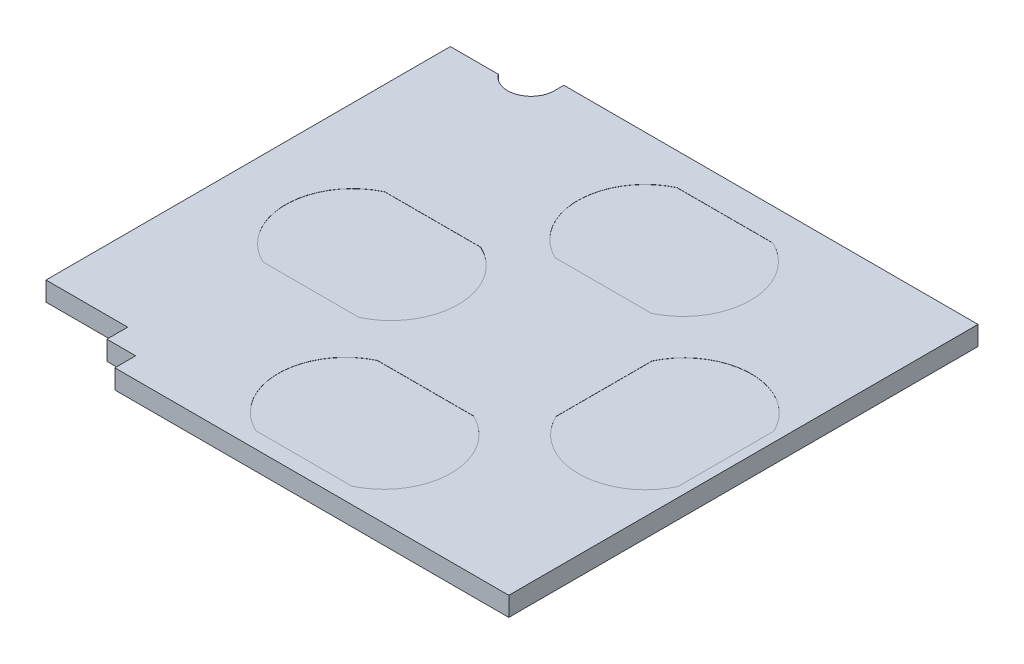
ISO-10303-21;
HEADER;
FILE_DESCRIPTION(('STEP AP214'),'2;1');
FILE_NAME('part.step','',(''),(''),'','','');
FILE_SCHEMA(('AUTOMOTIVE_DESIGN { 1 0 10303 214 1 1 1 1 }'));
ENDSEC;
DATA;
#1=APPLICATION_CONTEXT('core data for automotive mechanical design processes');
#2=APPLICATION_PROTOCOL_DEFINITION('international standard','automotive_design',2000,#1);
#3=PRODUCT_CONTEXT('',#1,'mechanical');
#4=PRODUCT('Part','Part','',(#3));
#5=PRODUCT_RELATED_PRODUCT_CATEGORY('part','',(#4));
#6=PRODUCT_DEFINITION_FORMATION('','',#4);
#7=PRODUCT_DEFINITION_CONTEXT('part definition',#1,'design');
#8=PRODUCT_DEFINITION('design','',#6,#7);
#9=PRODUCT_DEFINITION_SHAPE('','',#8);
#10=(LENGTH_UNIT() NAMED_UNIT(*) SI_UNIT(.MILLI.,.METRE.));
#11=(NAMED_UNIT(*) PLANE_ANGLE_UNIT() SI_UNIT($,.RADIAN.));
#12=(NAMED_UNIT(*) SI_UNIT($,.STERADIAN.) SOLID_ANGLE_UNIT());
#13=UNCERTAINTY_MEASURE_WITH_UNIT(LENGTH_MEASURE(1.E-05),#10,'distance_accuracy_value','');
#14=(GEOMETRIC_REPRESENTATION_CONTEXT(3) GLOBAL_UNCERTAINTY_ASSIGNED_CONTEXT((#13)) GLOBAL_UNIT_ASSIGNED_CONTEXT((#10,
#11,#12)) REPRESENTATION_CONTEXT('',''));
#15=CARTESIAN_POINT('',(0.,0.,0.));
#16=DIRECTION('',(0.,0.,1.));
#17=DIRECTION('',(1.,0.,0.));
#18=AXIS2_PLACEMENT_3D('',#15,#16,#17);
#19=CARTESIAN_POINT('',(-11.5711231832594,1.2,-12.7581254575403));
#20=DIRECTION('',(0.,-1.,0.));
#21=DIRECTION('',(0.,0.,-1.));
#22=AXIS2_PLACEMENT_3D('',#19,#20,#21);
#23=CYLINDRICAL_SURFACE('',#22,1.45812545754029);
#24=DIRECTION('',(0.,1.,0.));
#25=VECTOR('',#24,1.);
#26=CARTESIAN_POINT('',(-10.1129977257192,0.,-12.7581254575403));
#27=LINE('',#26,#25);
#28=CARTESIAN_POINT('',(-10.1129977257192,0.,-12.7581254575403));
#29=VERTEX_POINT('',#28);
#30=CARTESIAN_POINT('',(-10.1129977257192,1.2,-12.7581254575403));
#31=VERTEX_POINT('',#30);
#32=EDGE_CURVE('E350',#29,#31,#27,.T.);
#33=ORIENTED_EDGE('',*,*,#32,.F.);
#34=CARTESIAN_POINT('',(-11.5711231832594,0.,-12.7581254575403));
#35=DIRECTION('',(0.,-1.,0.));
#36=DIRECTION('',(0.,0.,1.));
#37=AXIS2_PLACEMENT_3D('',#34,#35,#36);
#38=CIRCLE('',#37,1.45812545754029);
#39=CARTESIAN_POINT('',(-12.75,0.,-11.9));
#40=VERTEX_POINT('',#39);
#41=EDGE_CURVE('E355',#29,#40,#38,.T.);
#42=ORIENTED_EDGE('',*,*,#41,.T.);
#43=DIRECTION('',(0.,-1.,0.));
#44=VECTOR('',#43,1.);
#45=CARTESIAN_POINT('',(-12.75,1.2,-11.9));
#46=LINE('',#45,#44);
#47=CARTESIAN_POINT('',(-12.75,1.2,-11.9));
#48=VERTEX_POINT('',#47);
#49=EDGE_CURVE('E11',#48,#40,#46,.T.);
#50=ORIENTED_EDGE('',*,*,#49,.F.);
#51=CARTESIAN_POINT('',(-11.5711231832594,1.2,-12.7581254575403));
#52=DIRECTION('',(0.,-1.,0.));
#53=DIRECTION('',(0.,0.,1.));
#54=AXIS2_PLACEMENT_3D('',#51,#52,#53);
#55=CIRCLE('',#54,1.45812545754029);
#56=EDGE_CURVE('E357',#31,#48,#55,.T.);
#57=ORIENTED_EDGE('',*,*,#56,.F.);
#58=EDGE_LOOP('',(#33,#42,#50,#57));
#59=FACE_BOUND('',#58,.T.);
#60=ADVANCED_FACE('F36',(#59),#23,.F.);
#61=CARTESIAN_POINT('',(-15.75,1.2,-11.9));
#62=DIRECTION('',(0.,0.,1.));
#63=DIRECTION('',(1.,0.,0.));
#64=AXIS2_PLACEMENT_3D('',#61,#62,#63);
#65=PLANE('',#64);
#66=DIRECTION('',(-1.,0.,0.));
#67=VECTOR('',#66,1.);
#68=CARTESIAN_POINT('',(-15.75,0.,-11.9));
#69=LINE('',#68,#67);
#70=CARTESIAN_POINT('',(-15.75,0.,-11.9));
#71=VERTEX_POINT('',#70);
#72=EDGE_CURVE('E381',#40,#71,#69,.T.);
#73=ORIENTED_EDGE('',*,*,#72,.T.);
#74=DIRECTION('',(0.,-1.,0.));
#75=VECTOR('',#74,1.);
#76=CARTESIAN_POINT('',(-15.75,1.2,-11.9));
#77=LINE('',#76,#75);
#78=CARTESIAN_POINT('',(-15.75,1.2,-11.9));
#79=VERTEX_POINT('',#78);
#80=EDGE_CURVE('E43',#79,#71,#77,.T.);
#81=ORIENTED_EDGE('',*,*,#80,.F.);
#82=DIRECTION('',(-1.,0.,0.));
#83=VECTOR('',#82,1.);
#84=CARTESIAN_POINT('',(-15.75,1.2,-11.9));
#85=LINE('',#84,#83);
#86=EDGE_CURVE('E359',#48,#79,#85,.T.);
#87=ORIENTED_EDGE('',*,*,#86,.F.);
#88=ORIENTED_EDGE('',*,*,#49,.T.);
#89=EDGE_LOOP('',(#73,#81,#87,#88));
#90=FACE_BOUND('',#89,.T.);
#91=ADVANCED_FACE('F449',(#90),#65,.F.);
#92=CARTESIAN_POINT('',(-15.75,1.2,13.35));
#93=DIRECTION('',(1.,0.,0.));
#94=DIRECTION('',(0.,0.,-1.));
#95=AXIS2_PLACEMENT_3D('',#92,#93,#94);
#96=PLANE('',#95);
#97=DIRECTION('',(0.,0.,1.));
#98=VECTOR('',#97,1.);
#99=CARTESIAN_POINT('',(-15.75,0.,13.35));
#100=LINE('',#99,#98);
#101=CARTESIAN_POINT('',(-15.75,0.,13.35));
#102=VERTEX_POINT('',#101);
#103=EDGE_CURVE('E383',#71,#102,#100,.T.);
#104=ORIENTED_EDGE('',*,*,#103,.T.);
#105=DIRECTION('',(0.,-1.,0.));
#106=VECTOR('',#105,1.);
#107=CARTESIAN_POINT('',(-15.75,1.2,13.35));
#108=LINE('',#107,#106);
#109=CARTESIAN_POINT('',(-15.75,1.2,13.35));
#110=VERTEX_POINT('',#109);
#111=EDGE_CURVE('E416',#110,#102,#108,.T.);
#112=ORIENTED_EDGE('',*,*,#111,.F.);
#113=DIRECTION('',(0.,0.,1.));
#114=VECTOR('',#113,1.);
#115=CARTESIAN_POINT('',(-15.75,1.2,13.35));
#116=LINE('',#115,#114);
#117=EDGE_CURVE('E362',#79,#110,#116,.T.);
#118=ORIENTED_EDGE('',*,*,#117,.F.);
#119=ORIENTED_EDGE('',*,*,#80,.T.);
#120=EDGE_LOOP('',(#104,#112,#118,#119));
#121=FACE_BOUND('',#120,.T.);
#122=ADVANCED_FACE('F423',(#121),#96,.F.);
#123=CARTESIAN_POINT('',(-10.65,1.2,13.35));
#124=DIRECTION('',(0.,0.,-1.));
#125=DIRECTION('',(-1.,0.,0.));
#126=AXIS2_PLACEMENT_3D('',#123,#124,#125);
#127=PLANE('',#126);
#128=DIRECTION('',(1.,0.,0.));
#129=VECTOR('',#128,1.);
#130=CARTESIAN_POINT('',(-10.65,0.,13.35));
#131=LINE('',#130,#129);
#132=CARTESIAN_POINT('',(-10.65,0.,13.35));
#133=VERTEX_POINT('',#132);
#134=EDGE_CURVE('E385',#102,#133,#131,.T.);
#135=ORIENTED_EDGE('',*,*,#134,.T.);
#136=DIRECTION('',(0.,-1.,0.));
#137=VECTOR('',#136,1.);
#138=CARTESIAN_POINT('',(-10.65,1.2,13.35));
#139=LINE('',#138,#137);
#140=CARTESIAN_POINT('',(-10.65,1.2,13.35));
#141=VERTEX_POINT('',#140);
#142=EDGE_CURVE('E413',#141,#133,#139,.T.);
#143=ORIENTED_EDGE('',*,*,#142,.F.);
#144=DIRECTION('',(1.,0.,0.));
#145=VECTOR('',#144,1.);
#146=CARTESIAN_POINT('',(-10.65,1.2,13.35));
#147=LINE('',#146,#145);
#148=EDGE_CURVE('E364',#110,#141,#147,.T.);
#149=ORIENTED_EDGE('',*,*,#148,.F.);
#150=ORIENTED_EDGE('',*,*,#111,.T.);
#151=EDGE_LOOP('',(#135,#143,#149,#150));
#152=FACE_BOUND('',#151,.T.);
#153=ADVANCED_FACE('F436',(#152),#127,.F.);
#154=CARTESIAN_POINT('',(-10.65,1.2,14.65));
#155=DIRECTION('',(1.,0.,0.));
#156=DIRECTION('',(0.,0.,-1.));
#157=AXIS2_PLACEMENT_3D('',#154,#155,#156);
#158=PLANE('',#157);
#159=DIRECTION('',(0.,0.,1.));
#160=VECTOR('',#159,1.);
#161=CARTESIAN_POINT('',(-10.65,0.,14.65));
#162=LINE('',#161,#160);
#163=CARTESIAN_POINT('',(-10.65,0.,14.65));
#164=VERTEX_POINT('',#163);
#165=EDGE_CURVE('E387',#133,#164,#162,.T.);
#166=ORIENTED_EDGE('',*,*,#165,.T.);
#167=DIRECTION('',(0.,-1.,0.));
#168=VECTOR('',#167,1.);
#169=CARTESIAN_POINT('',(-10.65,1.2,14.65));
#170=LINE('',#169,#168);
#171=CARTESIAN_POINT('',(-10.65,1.2,14.65));
#172=VERTEX_POINT('',#171);
#173=EDGE_CURVE('E410',#172,#164,#170,.T.);
#174=ORIENTED_EDGE('',*,*,#173,.F.);
#175=DIRECTION('',(0.,0.,1.));
#176=VECTOR('',#175,1.);
#177=CARTESIAN_POINT('',(-10.65,1.2,14.65));
#178=LINE('',#177,#176);
#179=EDGE_CURVE('E366',#141,#172,#178,.T.);
#180=ORIENTED_EDGE('',*,*,#179,.F.);
#181=ORIENTED_EDGE('',*,*,#142,.T.);
#182=EDGE_LOOP('',(#166,#174,#180,#181));
#183=FACE_BOUND('',#182,.T.);
#184=ADVANCED_FACE('F440',(#183),#158,.F.);
#185=CARTESIAN_POINT('',(-8.85000000000001,1.2,14.65));
#186=DIRECTION('',(0.,0.,-1.));
#187=DIRECTION('',(-1.,0.,0.));
#188=AXIS2_PLACEMENT_3D('',#185,#186,#187);
#189=PLANE('',#188);
#190=DIRECTION('',(1.,0.,0.));
#191=VECTOR('',#190,1.);
#192=CARTESIAN_POINT('',(-8.85000000000001,0.,14.65));
#193=LINE('',#192,#191);
#194=CARTESIAN_POINT('',(-8.85000000000001,0.,14.65));
#195=VERTEX_POINT('',#194);
#196=EDGE_CURVE('E389',#164,#195,#193,.T.);
#197=ORIENTED_EDGE('',*,*,#196,.T.);
#198=DIRECTION('',(0.,-1.,0.));
#199=VECTOR('',#198,1.);
#200=CARTESIAN_POINT('',(-8.85000000000001,1.2,14.65));
#201=LINE('',#200,#199);
#202=CARTESIAN_POINT('',(-8.85000000000001,1.2,14.65));
#203=VERTEX_POINT('',#202);
#204=EDGE_CURVE('E407',#203,#195,#201,.T.);
#205=ORIENTED_EDGE('',*,*,#204,.F.);
#206=DIRECTION('',(1.,0.,0.));
#207=VECTOR('',#206,1.);
#208=CARTESIAN_POINT('',(-8.85000000000001,1.2,14.65));
#209=LINE('',#208,#207);
#210=EDGE_CURVE('E368',#172,#203,#209,.T.);
#211=ORIENTED_EDGE('',*,*,#210,.F.);
#212=ORIENTED_EDGE('',*,*,#173,.T.);
#213=EDGE_LOOP('',(#197,#205,#211,#212));
#214=FACE_BOUND('',#213,.T.);
#215=ADVANCED_FACE('F473',(#214),#189,.F.);
#216=CARTESIAN_POINT('',(-8.85,1.2,15.95));
#217=DIRECTION('',(1.,0.,0.));
#218=DIRECTION('',(0.,0.,-1.));
#219=AXIS2_PLACEMENT_3D('',#216,#217,#218);
#220=PLANE('',#219);
#221=DIRECTION('',(0.,0.,1.));
#222=VECTOR('',#221,1.);
#223=CARTESIAN_POINT('',(-8.85,0.,15.95));
#224=LINE('',#223,#222);
#225=CARTESIAN_POINT('',(-8.85,0.,15.95));
#226=VERTEX_POINT('',#225);
#227=EDGE_CURVE('E391',#195,#226,#224,.T.);
#228=ORIENTED_EDGE('',*,*,#227,.T.);
#229=DIRECTION('',(0.,-1.,0.));
#230=VECTOR('',#229,1.);
#231=CARTESIAN_POINT('',(-8.85,1.2,15.95));
#232=LINE('',#231,#230);
#233=CARTESIAN_POINT('',(-8.85,1.2,15.95));
#234=VERTEX_POINT('',#233);
#235=EDGE_CURVE('E404',#234,#226,#232,.T.);
#236=ORIENTED_EDGE('',*,*,#235,.F.);
#237=DIRECTION('',(0.,0.,1.));
#238=VECTOR('',#237,1.);
#239=CARTESIAN_POINT('',(-8.85,1.2,15.95));
#240=LINE('',#239,#238);
#241=EDGE_CURVE('E370',#203,#234,#240,.T.);
#242=ORIENTED_EDGE('',*,*,#241,.F.);
#243=ORIENTED_EDGE('',*,*,#204,.T.);
#244=EDGE_LOOP('',(#228,#236,#242,#243));
#245=FACE_BOUND('',#244,.T.);
#246=ADVANCED_FACE('F471',(#245),#220,.F.);
#247=CARTESIAN_POINT('',(15.75,1.2,15.95));
#248=DIRECTION('',(0.,0.,-1.));
#249=DIRECTION('',(-1.,0.,0.));
#250=AXIS2_PLACEMENT_3D('',#247,#248,#249);
#251=PLANE('',#250);
#252=DIRECTION('',(1.,0.,0.));
#253=VECTOR('',#252,1.);
#254=CARTESIAN_POINT('',(15.75,0.,15.95));
#255=LINE('',#254,#253);
#256=CARTESIAN_POINT('',(15.75,0.,15.95));
#257=VERTEX_POINT('',#256);
#258=EDGE_CURVE('E393',#226,#257,#255,.T.);
#259=ORIENTED_EDGE('',*,*,#258,.T.);
#260=DIRECTION('',(0.,-1.,0.));
#261=VECTOR('',#260,1.);
#262=CARTESIAN_POINT('',(15.75,1.2,15.95));
#263=LINE('',#262,#261);
#264=CARTESIAN_POINT('',(15.75,1.2,15.95));
#265=VERTEX_POINT('',#264);
#266=EDGE_CURVE('E401',#265,#257,#263,.T.);
#267=ORIENTED_EDGE('',*,*,#266,.F.);
#268=DIRECTION('',(1.,0.,0.));
#269=VECTOR('',#268,1.);
#270=CARTESIAN_POINT('',(15.75,1.2,15.95));
#271=LINE('',#270,#269);
#272=EDGE_CURVE('E372',#234,#265,#271,.T.);
#273=ORIENTED_EDGE('',*,*,#272,.F.);
#274=ORIENTED_EDGE('',*,*,#235,.T.);
#275=EDGE_LOOP('',(#259,#267,#273,#274));
#276=FACE_BOUND('',#275,.T.);
#277=ADVANCED_FACE('F466',(#276),#251,.F.);
#278=CARTESIAN_POINT('',(15.75,1.2,-13.35));
#279=DIRECTION('',(-1.,0.,0.));
#280=DIRECTION('',(0.,0.,1.));
#281=AXIS2_PLACEMENT_3D('',#278,#279,#280);
#282=PLANE('',#281);
#283=DIRECTION('',(0.,0.,-1.));
#284=VECTOR('',#283,1.);
#285=CARTESIAN_POINT('',(15.75,0.,-13.35));
#286=LINE('',#285,#284);
#287=CARTESIAN_POINT('',(15.75,0.,-13.35));
#288=VERTEX_POINT('',#287);
#289=EDGE_CURVE('E395',#257,#288,#286,.T.);
#290=ORIENTED_EDGE('',*,*,#289,.T.);
#291=DIRECTION('',(0.,-1.,0.));
#292=VECTOR('',#291,1.);
#293=CARTESIAN_POINT('',(15.75,1.2,-13.35));
#294=LINE('',#293,#292);
#295=CARTESIAN_POINT('',(15.75,1.2,-13.35));
#296=VERTEX_POINT('',#295);
#297=EDGE_CURVE('E379',#296,#288,#294,.T.);
#298=ORIENTED_EDGE('',*,*,#297,.F.);
#299=DIRECTION('',(0.,0.,-1.));
#300=VECTOR('',#299,1.);
#301=CARTESIAN_POINT('',(15.75,1.2,-13.35));
#302=LINE('',#301,#300);
#303=EDGE_CURVE('E374',#265,#296,#302,.T.);
#304=ORIENTED_EDGE('',*,*,#303,.F.);
#305=ORIENTED_EDGE('',*,*,#266,.T.);
#306=EDGE_LOOP('',(#290,#298,#304,#305));
#307=FACE_BOUND('',#306,.T.);
#308=ADVANCED_FACE('F461',(#307),#282,.F.);
#309=CARTESIAN_POINT('',(-10.2385263290251,1.2,-13.35));
#310=DIRECTION('',(0.,0.,1.));
#311=DIRECTION('',(1.,0.,0.));
#312=AXIS2_PLACEMENT_3D('',#309,#310,#311);
#313=PLANE('',#312);
#314=DIRECTION('',(-1.,0.,0.));
#315=VECTOR('',#314,1.);
#316=CARTESIAN_POINT('',(-10.2385263290251,0.,-13.35));
#317=LINE('',#316,#315);
#318=CARTESIAN_POINT('',(-10.1129977257192,0.,-13.35));
#319=VERTEX_POINT('',#318);
#320=EDGE_CURVE('E360',#288,#319,#317,.T.);
#321=ORIENTED_EDGE('',*,*,#320,.T.);
#322=DIRECTION('',(0.,1.,0.));
#323=VECTOR('',#322,1.);
#324=CARTESIAN_POINT('',(-10.1129977257192,0.,-13.35));
#325=LINE('',#324,#323);
#326=CARTESIAN_POINT('',(-10.1129977257192,1.2,-13.35));
#327=VERTEX_POINT('',#326);
#328=EDGE_CURVE('E352',#319,#327,#325,.T.);
#329=ORIENTED_EDGE('',*,*,#328,.T.);
#330=DIRECTION('',(-1.,0.,0.));
#331=VECTOR('',#330,1.);
#332=CARTESIAN_POINT('',(-10.2385263290251,1.2,-13.35));
#333=LINE('',#332,#331);
#334=EDGE_CURVE('E376',#296,#327,#333,.T.);
#335=ORIENTED_EDGE('',*,*,#334,.F.);
#336=ORIENTED_EDGE('',*,*,#297,.T.);
#337=EDGE_LOOP('',(#321,#329,#335,#336));
#338=FACE_BOUND('',#337,.T.);
#339=ADVANCED_FACE('F456',(#338),#313,.F.);
#340=CARTESIAN_POINT('',(-11.5711231832594,1.2,-12.7581254575403));
#341=DIRECTION('',(0.,1.,0.));
#342=DIRECTION('',(0.,0.,1.));
#343=AXIS2_PLACEMENT_3D('',#340,#341,#342);
#344=PLANE('',#343);
#345=CARTESIAN_POINT('',(0.758333333333339,1.2,-7.55));
#346=DIRECTION('',(0.,1.,0.));
#347=DIRECTION('',(0.,0.,-1.));
#348=AXIS2_PLACEMENT_3D('',#345,#346,#347);
#349=CIRCLE('',#348,4.20833333333333);
#350=CARTESIAN_POINT('',(-1.05,1.2,-11.35));
#351=VERTEX_POINT('',#350);
#352=CARTESIAN_POINT('',(-1.05,1.2,-3.75));
#353=VERTEX_POINT('',#352);
#354=EDGE_CURVE('E50',#351,#353,#349,.T.);
#355=ORIENTED_EDGE('',*,*,#354,.F.);
#356=DIRECTION('',(-1.,0.,0.));
#357=VECTOR('',#356,1.);
#358=CARTESIAN_POINT('',(-1.05,1.2,-11.35));
#359=LINE('',#358,#357);
#360=CARTESIAN_POINT('',(4.95,1.2,-11.35));
#361=VERTEX_POINT('',#360);
#362=EDGE_CURVE('E234',#361,#351,#359,.T.);
#363=ORIENTED_EDGE('',*,*,#362,.F.);
#364=CARTESIAN_POINT('',(3.14166666666667,1.2,-7.55));
#365=DIRECTION('',(0.,1.,0.));
#366=DIRECTION('',(0.,0.,-1.));
#367=AXIS2_PLACEMENT_3D('',#364,#365,#366);
#368=CIRCLE('',#367,4.20833333333333);
#369=CARTESIAN_POINT('',(4.95,1.2,-3.75));
#370=VERTEX_POINT('',#369);
#371=EDGE_CURVE('E237',#370,#361,#368,.T.);
#372=ORIENTED_EDGE('',*,*,#371,.F.);
#373=DIRECTION('',(1.,0.,0.));
#374=VECTOR('',#373,1.);
#375=CARTESIAN_POINT('',(4.95,1.2,-3.75));
#376=LINE('',#375,#374);
#377=EDGE_CURVE('E243',#353,#370,#376,.T.);
#378=ORIENTED_EDGE('',*,*,#377,.F.);
#379=EDGE_LOOP('',(#355,#363,#372,#378));
#380=FACE_BOUND('',#379,.T.);
#381=CARTESIAN_POINT('',(0.758333333333345,1.2,11.15));
#382=DIRECTION('',(0.,1.,0.));
#383=DIRECTION('',(0.,0.,-1.));
#384=AXIS2_PLACEMENT_3D('',#381,#382,#383);
#385=CIRCLE('',#384,4.20833333333334);
#386=CARTESIAN_POINT('',(-1.05,1.2,7.35));
#387=VERTEX_POINT('',#386);
#388=CARTESIAN_POINT('',(-1.05,1.2,14.95));
#389=VERTEX_POINT('',#388);
#390=EDGE_CURVE('E58',#387,#389,#385,.T.);
#391=ORIENTED_EDGE('',*,*,#390,.F.);
#392=DIRECTION('',(-1.,0.,0.));
#393=VECTOR('',#392,1.);
#394=CARTESIAN_POINT('',(-1.05,1.2,7.35));
#395=LINE('',#394,#393);
#396=CARTESIAN_POINT('',(4.95,1.2,7.35));
#397=VERTEX_POINT('',#396);
#398=EDGE_CURVE('E258',#397,#387,#395,.T.);
#399=ORIENTED_EDGE('',*,*,#398,.F.);
#400=CARTESIAN_POINT('',(3.14166666666666,1.2,11.15));
#401=DIRECTION('',(0.,1.,0.));
#402=DIRECTION('',(0.,0.,-1.));
#403=AXIS2_PLACEMENT_3D('',#400,#401,#402);
#404=CIRCLE('',#403,4.20833333333334);
#405=CARTESIAN_POINT('',(4.95,1.2,14.95));
#406=VERTEX_POINT('',#405);
#407=EDGE_CURVE('E273',#406,#397,#404,.T.);
#408=ORIENTED_EDGE('',*,*,#407,.F.);
#409=DIRECTION('',(1.,0.,0.));
#410=VECTOR('',#409,1.);
#411=CARTESIAN_POINT('',(4.95,1.2,14.95));
#412=LINE('',#411,#410);
#413=EDGE_CURVE('E269',#389,#406,#412,.T.);
#414=ORIENTED_EDGE('',*,*,#413,.F.);
#415=EDGE_LOOP('',(#391,#399,#408,#414));
#416=FACE_BOUND('',#415,.T.);
#417=CARTESIAN_POINT('',(-8.14166666666667,1.2,1.8));
#418=DIRECTION('',(0.,1.,0.));
#419=DIRECTION('',(0.,0.,-1.));
#420=AXIS2_PLACEMENT_3D('',#417,#418,#419);
#421=CIRCLE('',#420,4.20833333333333);
#422=CARTESIAN_POINT('',(-9.95,1.2,-2.));
#423=VERTEX_POINT('',#422);
#424=CARTESIAN_POINT('',(-9.95,1.2,5.6));
#425=VERTEX_POINT('',#424);
#426=EDGE_CURVE('E298',#423,#425,#421,.T.);
#427=ORIENTED_EDGE('',*,*,#426,.F.);
#428=DIRECTION('',(-1.,0.,0.));
#429=VECTOR('',#428,1.);
#430=CARTESIAN_POINT('',(-9.95,1.2,-2.));
#431=LINE('',#430,#429);
#432=CARTESIAN_POINT('',(-3.95,1.2,-2.));
#433=VERTEX_POINT('',#432);
#434=EDGE_CURVE('E288',#433,#423,#431,.T.);
#435=ORIENTED_EDGE('',*,*,#434,.F.);
#436=CARTESIAN_POINT('',(-5.75833333333333,1.2,1.8));
#437=DIRECTION('',(0.,1.,0.));
#438=DIRECTION('',(0.,0.,-1.));
#439=AXIS2_PLACEMENT_3D('',#436,#437,#438);
#440=CIRCLE('',#439,4.20833333333333);
#441=CARTESIAN_POINT('',(-3.95,1.2,5.6));
#442=VERTEX_POINT('',#441);
#443=EDGE_CURVE('E304',#442,#433,#440,.T.);
#444=ORIENTED_EDGE('',*,*,#443,.F.);
#445=DIRECTION('',(1.,0.,0.));
#446=VECTOR('',#445,1.);
#447=CARTESIAN_POINT('',(-3.95,1.2,5.6));
#448=LINE('',#447,#446);
#449=EDGE_CURVE('E300',#425,#442,#448,.T.);
#450=ORIENTED_EDGE('',*,*,#449,.F.);
#451=EDGE_LOOP('',(#427,#435,#444,#450));
#452=FACE_BOUND('',#451,.T.);
#453=CARTESIAN_POINT('',(11.35,1.2,0.608333333333334));
#454=DIRECTION('',(0.,1.,0.));
#455=DIRECTION('',(0.,0.,-1.));
#456=AXIS2_PLACEMENT_3D('',#453,#454,#455);
#457=CIRCLE('',#456,4.20833333333333);
#458=CARTESIAN_POINT('',(15.15,1.2,-1.2));
#459=VERTEX_POINT('',#458);
#460=CARTESIAN_POINT('',(7.55000000000001,1.2,-1.2));
#461=VERTEX_POINT('',#460);
#462=EDGE_CURVE('E330',#459,#461,#457,.T.);
#463=ORIENTED_EDGE('',*,*,#462,.F.);
#464=DIRECTION('',(0.,0.,-1.));
#465=VECTOR('',#464,1.);
#466=CARTESIAN_POINT('',(15.15,1.2,-1.2));
#467=LINE('',#466,#465);
#468=CARTESIAN_POINT('',(15.15,1.2,4.8));
#469=VERTEX_POINT('',#468);
#470=EDGE_CURVE('E320',#469,#459,#467,.T.);
#471=ORIENTED_EDGE('',*,*,#470,.F.);
#472=CARTESIAN_POINT('',(11.35,1.2,2.99166666666667));
#473=DIRECTION('',(0.,1.,0.));
#474=DIRECTION('',(0.,0.,1.));
#475=AXIS2_PLACEMENT_3D('',#472,#473,#474);
#476=CIRCLE('',#475,4.20833333333333);
#477=CARTESIAN_POINT('',(7.55000000000001,1.2,4.8));
#478=VERTEX_POINT('',#477);
#479=EDGE_CURVE('E335',#478,#469,#476,.T.);
#480=ORIENTED_EDGE('',*,*,#479,.F.);
#481=DIRECTION('',(0.,0.,1.));
#482=VECTOR('',#481,1.);
#483=CARTESIAN_POINT('',(7.55000000000001,1.2,-1.2));
#484=LINE('',#483,#482);
#485=EDGE_CURVE('E332',#461,#478,#484,.T.);
#486=ORIENTED_EDGE('',*,*,#485,.F.);
#487=EDGE_LOOP('',(#463,#471,#480,#486));
#488=FACE_BOUND('',#487,.T.);
#489=DIRECTION('',(0.,0.,-1.));
#490=VECTOR('',#489,1.);
#491=CARTESIAN_POINT('',(-10.1129977257192,1.2,-12.7581254575403));
#492=LINE('',#491,#490);
#493=EDGE_CURVE('E250',#31,#327,#492,.T.);
#494=ORIENTED_EDGE('',*,*,#493,.F.);
#495=ORIENTED_EDGE('',*,*,#56,.T.);
#496=ORIENTED_EDGE('',*,*,#86,.T.);
#497=ORIENTED_EDGE('',*,*,#117,.T.);
#498=ORIENTED_EDGE('',*,*,#148,.T.);
#499=ORIENTED_EDGE('',*,*,#179,.T.);
#500=ORIENTED_EDGE('',*,*,#210,.T.);
#501=ORIENTED_EDGE('',*,*,#241,.T.);
#502=ORIENTED_EDGE('',*,*,#272,.T.);
#503=ORIENTED_EDGE('',*,*,#303,.T.);
#504=ORIENTED_EDGE('',*,*,#334,.T.);
#505=EDGE_LOOP('',(#494,#495,#496,#497,#498,#499,#500,#501,#502,#503,#504));
#506=FACE_BOUND('',#505,.T.);
#507=ADVANCED_FACE('F445',(#380,#416,#452,#488,#506),#344,.T.);
#508=CARTESIAN_POINT('',(-11.5711231832594,0.,-12.7581254575403));
#509=DIRECTION('',(0.,1.,0.));
#510=DIRECTION('',(0.,0.,1.));
#511=AXIS2_PLACEMENT_3D('',#508,#509,#510);
#512=PLANE('',#511);
#513=ORIENTED_EDGE('',*,*,#41,.F.);
#514=DIRECTION('',(0.,0.,-1.));
#515=VECTOR('',#514,1.);
#516=CARTESIAN_POINT('',(-10.1129977257192,0.,-12.7581254575403));
#517=LINE('',#516,#515);
#518=EDGE_CURVE('E347',#29,#319,#517,.T.);
#519=ORIENTED_EDGE('',*,*,#518,.T.);
#520=ORIENTED_EDGE('',*,*,#320,.F.);
#521=ORIENTED_EDGE('',*,*,#289,.F.);
#522=ORIENTED_EDGE('',*,*,#258,.F.);
#523=ORIENTED_EDGE('',*,*,#227,.F.);
#524=ORIENTED_EDGE('',*,*,#196,.F.);
#525=ORIENTED_EDGE('',*,*,#165,.F.);
#526=ORIENTED_EDGE('',*,*,#134,.F.);
#527=ORIENTED_EDGE('',*,*,#103,.F.);
#528=ORIENTED_EDGE('',*,*,#72,.F.);
#529=EDGE_LOOP('',(#513,#519,#520,#521,#522,#523,#524,#525,#526,#527,#528));
#530=FACE_BOUND('',#529,.T.);
#531=ADVANCED_FACE('F431',(#530),#512,.F.);
#532=CARTESIAN_POINT('',(-10.1129977257192,0.,-12.7581254575403));
#533=DIRECTION('',(1.,0.,0.));
#534=DIRECTION('',(0.,0.,-1.));
#535=AXIS2_PLACEMENT_3D('',#532,#533,#534);
#536=PLANE('',#535);
#537=ORIENTED_EDGE('',*,*,#493,.T.);
#538=ORIENTED_EDGE('',*,*,#328,.F.);
#539=ORIENTED_EDGE('',*,*,#518,.F.);
#540=ORIENTED_EDGE('',*,*,#32,.T.);
#541=EDGE_LOOP('',(#537,#538,#539,#540));
#542=FACE_BOUND('',#541,.T.);
#543=ADVANCED_FACE('F550',(#542),#536,.F.);
#544=CARTESIAN_POINT('',(11.35,1.19,0.608333333333334));
#545=DIRECTION('',(0.,1.,0.));
#546=DIRECTION('',(0.,0.,1.));
#547=AXIS2_PLACEMENT_3D('',#544,#545,#546);
#548=CYLINDRICAL_SURFACE('',#547,4.20833333333333);
#549=ORIENTED_EDGE('',*,*,#462,.T.);
#550=DIRECTION('',(0.,1.,0.));
#551=VECTOR('',#550,1.);
#552=CARTESIAN_POINT('',(7.55000000000001,1.19,-1.2));
#553=LINE('',#552,#551);
#554=CARTESIAN_POINT('',(7.55000000000001,1.19,-1.2));
#555=VERTEX_POINT('',#554);
#556=EDGE_CURVE('E329',#555,#461,#553,.T.);
#557=ORIENTED_EDGE('',*,*,#556,.F.);
#558=CARTESIAN_POINT('',(11.35,1.19,0.608333333333334));
#559=DIRECTION('',(0.,1.,0.));
#560=DIRECTION('',(0.,0.,-1.));
#561=AXIS2_PLACEMENT_3D('',#558,#559,#560);
#562=CIRCLE('',#561,4.20833333333333);
#563=CARTESIAN_POINT('',(15.15,1.19,-1.2));
#564=VERTEX_POINT('',#563);
#565=EDGE_CURVE('E316',#564,#555,#562,.T.);
#566=ORIENTED_EDGE('',*,*,#565,.F.);
#567=DIRECTION('',(0.,1.,0.));
#568=VECTOR('',#567,1.);
#569=CARTESIAN_POINT('',(15.15,1.19,-1.2));
#570=LINE('',#569,#568);
#571=EDGE_CURVE('E301',#564,#459,#570,.T.);
#572=ORIENTED_EDGE('',*,*,#571,.T.);
#573=EDGE_LOOP('',(#549,#557,#566,#572));
#574=FACE_BOUND('',#573,.T.);
#575=ADVANCED_FACE('F558',(#574),#548,.F.);
#576=CARTESIAN_POINT('',(15.15,1.19,-1.2));
#577=DIRECTION('',(1.,0.,0.));
#578=DIRECTION('',(0.,0.,-1.));
#579=AXIS2_PLACEMENT_3D('',#576,#577,#578);
#580=PLANE('',#579);
#581=ORIENTED_EDGE('',*,*,#470,.T.);
#582=ORIENTED_EDGE('',*,*,#571,.F.);
#583=DIRECTION('',(0.,0.,-1.));
#584=VECTOR('',#583,1.);
#585=CARTESIAN_POINT('',(15.15,1.19,-1.2));
#586=LINE('',#585,#584);
#587=CARTESIAN_POINT('',(15.15,1.19,4.8));
#588=VERTEX_POINT('',#587);
#589=EDGE_CURVE('E326',#588,#564,#586,.T.);
#590=ORIENTED_EDGE('',*,*,#589,.F.);
#591=DIRECTION('',(0.,1.,0.));
#592=VECTOR('',#591,1.);
#593=CARTESIAN_POINT('',(15.15,1.19,4.8));
#594=LINE('',#593,#592);
#595=EDGE_CURVE('E341',#588,#469,#594,.T.);
#596=ORIENTED_EDGE('',*,*,#595,.T.);
#597=EDGE_LOOP('',(#581,#582,#590,#596));
#598=FACE_BOUND('',#597,.T.);
#599=ADVANCED_FACE('F574',(#598),#580,.F.);
#600=CARTESIAN_POINT('',(11.35,1.19,2.99166666666667));
#601=DIRECTION('',(0.,1.,0.));
#602=DIRECTION('',(0.,0.,1.));
#603=AXIS2_PLACEMENT_3D('',#600,#601,#602);
#604=CYLINDRICAL_SURFACE('',#603,4.20833333333333);
#605=ORIENTED_EDGE('',*,*,#479,.T.);
#606=ORIENTED_EDGE('',*,*,#595,.F.);
#607=CARTESIAN_POINT('',(11.35,1.19,2.99166666666667));
#608=DIRECTION('',(0.,1.,0.));
#609=DIRECTION('',(0.,0.,1.));
#610=AXIS2_PLACEMENT_3D('',#607,#608,#609);
#611=CIRCLE('',#610,4.20833333333333);
#612=CARTESIAN_POINT('',(7.55000000000001,1.19,4.8));
#613=VERTEX_POINT('',#612);
#614=EDGE_CURVE('E323',#613,#588,#611,.T.);
#615=ORIENTED_EDGE('',*,*,#614,.F.);
#616=DIRECTION('',(0.,1.,0.));
#617=VECTOR('',#616,1.);
#618=CARTESIAN_POINT('',(7.55000000000001,1.19,4.8));
#619=LINE('',#618,#617);
#620=EDGE_CURVE('E343',#613,#478,#619,.T.);
#621=ORIENTED_EDGE('',*,*,#620,.T.);
#622=EDGE_LOOP('',(#605,#606,#615,#621));
#623=FACE_BOUND('',#622,.T.);
#624=ADVANCED_FACE('F584',(#623),#604,.F.);
#625=CARTESIAN_POINT('',(7.55000000000001,1.19,-1.2));
#626=DIRECTION('',(-1.,0.,0.));
#627=DIRECTION('',(0.,0.,1.));
#628=AXIS2_PLACEMENT_3D('',#625,#626,#627);
#629=PLANE('',#628);
#630=ORIENTED_EDGE('',*,*,#485,.T.);
#631=ORIENTED_EDGE('',*,*,#620,.F.);
#632=DIRECTION('',(0.,0.,1.));
#633=VECTOR('',#632,1.);
#634=CARTESIAN_POINT('',(7.55000000000001,1.19,-1.2));
#635=LINE('',#634,#633);
#636=EDGE_CURVE('E319',#555,#613,#635,.T.);
#637=ORIENTED_EDGE('',*,*,#636,.F.);
#638=ORIENTED_EDGE('',*,*,#556,.T.);
#639=EDGE_LOOP('',(#630,#631,#637,#638));
#640=FACE_BOUND('',#639,.T.);
#641=ADVANCED_FACE('F594',(#640),#629,.F.);
#642=CARTESIAN_POINT('',(11.35,1.19,0.608333333333334));
#643=DIRECTION('',(0.,-1.,0.));
#644=DIRECTION('',(0.,0.,-1.));
#645=AXIS2_PLACEMENT_3D('',#642,#643,#644);
#646=PLANE('',#645);
#647=ORIENTED_EDGE('',*,*,#565,.T.);
#648=ORIENTED_EDGE('',*,*,#636,.T.);
#649=ORIENTED_EDGE('',*,*,#614,.T.);
#650=ORIENTED_EDGE('',*,*,#589,.T.);
#651=EDGE_LOOP('',(#647,#648,#649,#650));
#652=FACE_BOUND('',#651,.T.);
#653=ADVANCED_FACE('F604',(#652),#646,.F.);
#654=CARTESIAN_POINT('',(-8.14166666666667,1.19,1.8));
#655=DIRECTION('',(0.,1.,0.));
#656=DIRECTION('',(0.,0.,1.));
#657=AXIS2_PLACEMENT_3D('',#654,#655,#656);
#658=CYLINDRICAL_SURFACE('',#657,4.20833333333333);
#659=ORIENTED_EDGE('',*,*,#426,.T.);
#660=DIRECTION('',(0.,1.,0.));
#661=VECTOR('',#660,1.);
#662=CARTESIAN_POINT('',(-9.95,1.19,5.6));
#663=LINE('',#662,#661);
#664=CARTESIAN_POINT('',(-9.95,1.19,5.6));
#665=VERTEX_POINT('',#664);
#666=EDGE_CURVE('E297',#665,#425,#663,.T.);
#667=ORIENTED_EDGE('',*,*,#666,.F.);
#668=CARTESIAN_POINT('',(-8.14166666666667,1.19,1.8));
#669=DIRECTION('',(0.,1.,0.));
#670=DIRECTION('',(0.,0.,-1.));
#671=AXIS2_PLACEMENT_3D('',#668,#669,#670);
#672=CIRCLE('',#671,4.20833333333333);
#673=CARTESIAN_POINT('',(-9.95,1.19,-2.));
#674=VERTEX_POINT('',#673);
#675=EDGE_CURVE('E284',#674,#665,#672,.T.);
#676=ORIENTED_EDGE('',*,*,#675,.F.);
#677=DIRECTION('',(0.,1.,0.));
#678=VECTOR('',#677,1.);
#679=CARTESIAN_POINT('',(-9.95,1.19,-2.));
#680=LINE('',#679,#678);
#681=EDGE_CURVE('E270',#674,#423,#680,.T.);
#682=ORIENTED_EDGE('',*,*,#681,.T.);
#683=EDGE_LOOP('',(#659,#667,#676,#682));
#684=FACE_BOUND('',#683,.T.);
#685=ADVANCED_FACE('F614',(#684),#658,.F.);
#686=CARTESIAN_POINT('',(-9.95,1.19,-2.));
#687=DIRECTION('',(0.,0.,-1.));
#688=DIRECTION('',(-1.,0.,0.));
#689=AXIS2_PLACEMENT_3D('',#686,#687,#688);
#690=PLANE('',#689);
#691=ORIENTED_EDGE('',*,*,#434,.T.);
#692=ORIENTED_EDGE('',*,*,#681,.F.);
#693=DIRECTION('',(-1.,0.,0.));
#694=VECTOR('',#693,1.);
#695=CARTESIAN_POINT('',(-9.95,1.19,-2.));
#696=LINE('',#695,#694);
#697=CARTESIAN_POINT('',(-3.95,1.19,-2.));
#698=VERTEX_POINT('',#697);
#699=EDGE_CURVE('E294',#698,#674,#696,.T.);
#700=ORIENTED_EDGE('',*,*,#699,.F.);
#701=DIRECTION('',(0.,1.,0.));
#702=VECTOR('',#701,1.);
#703=CARTESIAN_POINT('',(-3.95,1.19,-2.));
#704=LINE('',#703,#702);
#705=EDGE_CURVE('E310',#698,#433,#704,.T.);
#706=ORIENTED_EDGE('',*,*,#705,.T.);
#707=EDGE_LOOP('',(#691,#692,#700,#706));
#708=FACE_BOUND('',#707,.T.);
#709=ADVANCED_FACE('F624',(#708),#690,.F.);
#710=CARTESIAN_POINT('',(-5.75833333333333,1.19,1.8));
#711=DIRECTION('',(0.,1.,0.));
#712=DIRECTION('',(0.,0.,1.));
#713=AXIS2_PLACEMENT_3D('',#710,#711,#712);
#714=CYLINDRICAL_SURFACE('',#713,4.20833333333333);
#715=ORIENTED_EDGE('',*,*,#443,.T.);
#716=ORIENTED_EDGE('',*,*,#705,.F.);
#717=CARTESIAN_POINT('',(-5.75833333333333,1.19,1.8));
#718=DIRECTION('',(0.,1.,0.));
#719=DIRECTION('',(0.,0.,-1.));
#720=AXIS2_PLACEMENT_3D('',#717,#718,#719);
#721=CIRCLE('',#720,4.20833333333333);
#722=CARTESIAN_POINT('',(-3.95,1.19,5.6));
#723=VERTEX_POINT('',#722);
#724=EDGE_CURVE('E291',#723,#698,#721,.T.);
#725=ORIENTED_EDGE('',*,*,#724,.F.);
#726=DIRECTION('',(0.,1.,0.));
#727=VECTOR('',#726,1.);
#728=CARTESIAN_POINT('',(-3.95,1.19,5.6));
#729=LINE('',#728,#727);
#730=EDGE_CURVE('E312',#723,#442,#729,.T.);
#731=ORIENTED_EDGE('',*,*,#730,.T.);
#732=EDGE_LOOP('',(#715,#716,#725,#731));
#733=FACE_BOUND('',#732,.T.);
#734=ADVANCED_FACE('F634',(#733),#714,.F.);
#735=CARTESIAN_POINT('',(-3.95,1.19,5.6));
#736=DIRECTION('',(0.,0.,1.));
#737=DIRECTION('',(1.,0.,0.));
#738=AXIS2_PLACEMENT_3D('',#735,#736,#737);
#739=PLANE('',#738);
#740=ORIENTED_EDGE('',*,*,#449,.T.);
#741=ORIENTED_EDGE('',*,*,#730,.F.);
#742=DIRECTION('',(1.,0.,0.));
#743=VECTOR('',#742,1.);
#744=CARTESIAN_POINT('',(-3.95,1.19,5.6));
#745=LINE('',#744,#743);
#746=EDGE_CURVE('E287',#665,#723,#745,.T.);
#747=ORIENTED_EDGE('',*,*,#746,.F.);
#748=ORIENTED_EDGE('',*,*,#666,.T.);
#749=EDGE_LOOP('',(#740,#741,#747,#748));
#750=FACE_BOUND('',#749,.T.);
#751=ADVANCED_FACE('F644',(#750),#739,.F.);
#752=CARTESIAN_POINT('',(-8.14166666666667,1.19,1.8));
#753=DIRECTION('',(0.,-1.,0.));
#754=DIRECTION('',(0.,0.,-1.));
#755=AXIS2_PLACEMENT_3D('',#752,#753,#754);
#756=PLANE('',#755);
#757=ORIENTED_EDGE('',*,*,#675,.T.);
#758=ORIENTED_EDGE('',*,*,#746,.T.);
#759=ORIENTED_EDGE('',*,*,#724,.T.);
#760=ORIENTED_EDGE('',*,*,#699,.T.);
#761=EDGE_LOOP('',(#757,#758,#759,#760));
#762=FACE_BOUND('',#761,.T.);
#763=ADVANCED_FACE('F654',(#762),#756,.F.);
#764=CARTESIAN_POINT('',(0.758333333333345,1.19,11.15));
#765=DIRECTION('',(0.,1.,0.));
#766=DIRECTION('',(0.,0.,1.));
#767=AXIS2_PLACEMENT_3D('',#764,#765,#766);
#768=CYLINDRICAL_SURFACE('',#767,4.20833333333334);
#769=ORIENTED_EDGE('',*,*,#390,.T.);
#770=DIRECTION('',(0.,1.,0.));
#771=VECTOR('',#770,1.);
#772=CARTESIAN_POINT('',(-1.05,1.19,14.95));
#773=LINE('',#772,#771);
#774=CARTESIAN_POINT('',(-1.05,1.19,14.95));
#775=VERTEX_POINT('',#774);
#776=EDGE_CURVE('E267',#775,#389,#773,.T.);
#777=ORIENTED_EDGE('',*,*,#776,.F.);
#778=CARTESIAN_POINT('',(0.758333333333345,1.19,11.15));
#779=DIRECTION('',(0.,1.,0.));
#780=DIRECTION('',(0.,0.,-1.));
#781=AXIS2_PLACEMENT_3D('',#778,#779,#780);
#782=CIRCLE('',#781,4.20833333333334);
#783=CARTESIAN_POINT('',(-1.05,1.19,7.35));
#784=VERTEX_POINT('',#783);
#785=EDGE_CURVE('E254',#784,#775,#782,.T.);
#786=ORIENTED_EDGE('',*,*,#785,.F.);
#787=DIRECTION('',(0.,1.,0.));
#788=VECTOR('',#787,1.);
#789=CARTESIAN_POINT('',(-1.05,1.19,7.35));
#790=LINE('',#789,#788);
#791=EDGE_CURVE('E244',#784,#387,#790,.T.);
#792=ORIENTED_EDGE('',*,*,#791,.T.);
#793=EDGE_LOOP('',(#769,#777,#786,#792));
#794=FACE_BOUND('',#793,.T.);
#795=ADVANCED_FACE('F664',(#794),#768,.F.);
#796=CARTESIAN_POINT('',(-1.05,1.19,7.35));
#797=DIRECTION('',(0.,0.,-1.));
#798=DIRECTION('',(-1.,0.,0.));
#799=AXIS2_PLACEMENT_3D('',#796,#797,#798);
#800=PLANE('',#799);
#801=ORIENTED_EDGE('',*,*,#398,.T.);
#802=ORIENTED_EDGE('',*,*,#791,.F.);
#803=DIRECTION('',(-1.,0.,0.));
#804=VECTOR('',#803,1.);
#805=CARTESIAN_POINT('',(-1.05,1.19,7.35));
#806=LINE('',#805,#804);
#807=CARTESIAN_POINT('',(4.95,1.19,7.35));
#808=VERTEX_POINT('',#807);
#809=EDGE_CURVE('E264',#808,#784,#806,.T.);
#810=ORIENTED_EDGE('',*,*,#809,.F.);
#811=DIRECTION('',(0.,1.,0.));
#812=VECTOR('',#811,1.);
#813=CARTESIAN_POINT('',(4.95,1.19,7.35));
#814=LINE('',#813,#812);
#815=EDGE_CURVE('E279',#808,#397,#814,.T.);
#816=ORIENTED_EDGE('',*,*,#815,.T.);
#817=EDGE_LOOP('',(#801,#802,#810,#816));
#818=FACE_BOUND('',#817,.T.);
#819=ADVANCED_FACE('F674',(#818),#800,.F.);
#820=CARTESIAN_POINT('',(3.14166666666666,1.19,11.15));
#821=DIRECTION('',(0.,1.,0.));
#822=DIRECTION('',(0.,0.,1.));
#823=AXIS2_PLACEMENT_3D('',#820,#821,#822);
#824=CYLINDRICAL_SURFACE('',#823,4.20833333333334);
#825=ORIENTED_EDGE('',*,*,#407,.T.);
#826=ORIENTED_EDGE('',*,*,#815,.F.);
#827=CARTESIAN_POINT('',(3.14166666666666,1.19,11.15));
#828=DIRECTION('',(0.,1.,0.));
#829=DIRECTION('',(0.,0.,-1.));
#830=AXIS2_PLACEMENT_3D('',#827,#828,#829);
#831=CIRCLE('',#830,4.20833333333334);
#832=CARTESIAN_POINT('',(4.95,1.19,14.95));
#833=VERTEX_POINT('',#832);
#834=EDGE_CURVE('E261',#833,#808,#831,.T.);
#835=ORIENTED_EDGE('',*,*,#834,.F.);
#836=DIRECTION('',(0.,1.,0.));
#837=VECTOR('',#836,1.);
#838=CARTESIAN_POINT('',(4.95,1.19,14.95));
#839=LINE('',#838,#837);
#840=EDGE_CURVE('E281',#833,#406,#839,.T.);
#841=ORIENTED_EDGE('',*,*,#840,.T.);
#842=EDGE_LOOP('',(#825,#826,#835,#841));
#843=FACE_BOUND('',#842,.T.);
#844=ADVANCED_FACE('F683',(#843),#824,.F.);
#845=CARTESIAN_POINT('',(4.95,1.19,14.95));
#846=DIRECTION('',(0.,0.,1.));
#847=DIRECTION('',(1.,0.,0.));
#848=AXIS2_PLACEMENT_3D('',#845,#846,#847);
#849=PLANE('',#848);
#850=ORIENTED_EDGE('',*,*,#413,.T.);
#851=ORIENTED_EDGE('',*,*,#840,.F.);
#852=DIRECTION('',(1.,0.,0.));
#853=VECTOR('',#852,1.);
#854=CARTESIAN_POINT('',(4.95,1.19,14.95));
#855=LINE('',#854,#853);
#856=EDGE_CURVE('E257',#775,#833,#855,.T.);
#857=ORIENTED_EDGE('',*,*,#856,.F.);
#858=ORIENTED_EDGE('',*,*,#776,.T.);
#859=EDGE_LOOP('',(#850,#851,#857,#858));
#860=FACE_BOUND('',#859,.T.);
#861=ADVANCED_FACE('F693',(#860),#849,.F.);
#862=CARTESIAN_POINT('',(0.758333333333345,1.19,11.15));
#863=DIRECTION('',(0.,-1.,0.));
#864=DIRECTION('',(0.,0.,-1.));
#865=AXIS2_PLACEMENT_3D('',#862,#863,#864);
#866=PLANE('',#865);
#867=ORIENTED_EDGE('',*,*,#785,.T.);
#868=ORIENTED_EDGE('',*,*,#856,.T.);
#869=ORIENTED_EDGE('',*,*,#834,.T.);
#870=ORIENTED_EDGE('',*,*,#809,.T.);
#871=EDGE_LOOP('',(#867,#868,#869,#870));
#872=FACE_BOUND('',#871,.T.);
#873=ADVANCED_FACE('F703',(#872),#866,.F.);
#874=CARTESIAN_POINT('',(0.758333333333339,1.19,-7.55));
#875=DIRECTION('',(0.,1.,0.));
#876=DIRECTION('',(0.,0.,1.));
#877=AXIS2_PLACEMENT_3D('',#874,#875,#876);
#878=CYLINDRICAL_SURFACE('',#877,4.20833333333333);
#879=ORIENTED_EDGE('',*,*,#354,.T.);
#880=DIRECTION('',(0.,1.,0.));
#881=VECTOR('',#880,1.);
#882=CARTESIAN_POINT('',(-1.05,1.19,-3.75));
#883=LINE('',#882,#881);
#884=CARTESIAN_POINT('',(-1.05,1.19,-3.75));
#885=VERTEX_POINT('',#884);
#886=EDGE_CURVE('E212',#885,#353,#883,.T.);
#887=ORIENTED_EDGE('',*,*,#886,.F.);
#888=CARTESIAN_POINT('',(0.758333333333339,1.19,-7.55));
#889=DIRECTION('',(0.,1.,0.));
#890=DIRECTION('',(0.,0.,-1.));
#891=AXIS2_PLACEMENT_3D('',#888,#889,#890);
#892=CIRCLE('',#891,4.20833333333333);
#893=CARTESIAN_POINT('',(-1.05,1.19,-11.35));
#894=VERTEX_POINT('',#893);
#895=EDGE_CURVE('E216',#894,#885,#892,.T.);
#896=ORIENTED_EDGE('',*,*,#895,.F.);
#897=DIRECTION('',(0.,1.,0.));
#898=VECTOR('',#897,1.);
#899=CARTESIAN_POINT('',(-1.05,1.19,-11.35));
#900=LINE('',#899,#898);
#901=EDGE_CURVE('E248',#894,#351,#900,.T.);
#902=ORIENTED_EDGE('',*,*,#901,.T.);
#903=EDGE_LOOP('',(#879,#887,#896,#902));
#904=FACE_BOUND('',#903,.T.);
#905=ADVANCED_FACE('F214',(#904),#878,.F.);
#906=CARTESIAN_POINT('',(-1.05,1.19,-11.35));
#907=DIRECTION('',(0.,0.,-1.));
#908=DIRECTION('',(-1.,0.,0.));
#909=AXIS2_PLACEMENT_3D('',#906,#907,#908);
#910=PLANE('',#909);
#911=ORIENTED_EDGE('',*,*,#362,.T.);
#912=ORIENTED_EDGE('',*,*,#901,.F.);
#913=DIRECTION('',(-1.,0.,0.));
#914=VECTOR('',#913,1.);
#915=CARTESIAN_POINT('',(-1.05,1.19,-11.35));
#916=LINE('',#915,#914);
#917=CARTESIAN_POINT('',(4.95,1.19,-11.35));
#918=VERTEX_POINT('',#917);
#919=EDGE_CURVE('E222',#918,#894,#916,.T.);
#920=ORIENTED_EDGE('',*,*,#919,.F.);
#921=DIRECTION('',(0.,1.,0.));
#922=VECTOR('',#921,1.);
#923=CARTESIAN_POINT('',(4.95,1.19,-11.35));
#924=LINE('',#923,#922);
#925=EDGE_CURVE('E251',#918,#361,#924,.T.);
#926=ORIENTED_EDGE('',*,*,#925,.T.);
#927=EDGE_LOOP('',(#911,#912,#920,#926));
#928=FACE_BOUND('',#927,.T.);
#929=ADVANCED_FACE('F722',(#928),#910,.F.);
#930=CARTESIAN_POINT('',(3.14166666666667,1.19,-7.55));
#931=DIRECTION('',(0.,1.,0.));
#932=DIRECTION('',(0.,0.,1.));
#933=AXIS2_PLACEMENT_3D('',#930,#931,#932);
#934=CYLINDRICAL_SURFACE('',#933,4.20833333333333);
#935=ORIENTED_EDGE('',*,*,#371,.T.);
#936=ORIENTED_EDGE('',*,*,#925,.F.);
#937=CARTESIAN_POINT('',(3.14166666666667,1.19,-7.55));
#938=DIRECTION('',(0.,1.,0.));
#939=DIRECTION('',(0.,0.,-1.));
#940=AXIS2_PLACEMENT_3D('',#937,#938,#939);
#941=CIRCLE('',#940,4.20833333333333);
#942=CARTESIAN_POINT('',(4.95,1.19,-3.75));
#943=VERTEX_POINT('',#942);
#944=EDGE_CURVE('E230',#943,#918,#941,.T.);
#945=ORIENTED_EDGE('',*,*,#944,.F.);
#946=DIRECTION('',(0.,1.,0.));
#947=VECTOR('',#946,1.);
#948=CARTESIAN_POINT('',(4.95,1.19,-3.75));
#949=LINE('',#948,#947);
#950=EDGE_CURVE('E221',#943,#370,#949,.T.);
#951=ORIENTED_EDGE('',*,*,#950,.T.);
#952=EDGE_LOOP('',(#935,#936,#945,#951));
#953=FACE_BOUND('',#952,.T.);
#954=ADVANCED_FACE('F731',(#953),#934,.F.);
#955=CARTESIAN_POINT('',(4.95,1.19,-3.75));
#956=DIRECTION('',(0.,0.,1.));
#957=DIRECTION('',(1.,0.,0.));
#958=AXIS2_PLACEMENT_3D('',#955,#956,#957);
#959=PLANE('',#958);
#960=ORIENTED_EDGE('',*,*,#377,.T.);
#961=ORIENTED_EDGE('',*,*,#950,.F.);
#962=DIRECTION('',(1.,0.,0.));
#963=VECTOR('',#962,1.);
#964=CARTESIAN_POINT('',(4.95,1.19,-3.75));
#965=LINE('',#964,#963);
#966=EDGE_CURVE('E225',#885,#943,#965,.T.);
#967=ORIENTED_EDGE('',*,*,#966,.F.);
#968=ORIENTED_EDGE('',*,*,#886,.T.);
#969=EDGE_LOOP('',(#960,#961,#967,#968));
#970=FACE_BOUND('',#969,.T.);
#971=ADVANCED_FACE('F226',(#970),#959,.F.);
#972=CARTESIAN_POINT('',(0.758333333333339,1.19,-7.55));
#973=DIRECTION('',(0.,-1.,0.));
#974=DIRECTION('',(0.,0.,-1.));
#975=AXIS2_PLACEMENT_3D('',#972,#973,#974);
#976=PLANE('',#975);
#977=ORIENTED_EDGE('',*,*,#895,.T.);
#978=ORIENTED_EDGE('',*,*,#966,.T.);
#979=ORIENTED_EDGE('',*,*,#944,.T.);
#980=ORIENTED_EDGE('',*,*,#919,.T.);
#981=EDGE_LOOP('',(#977,#978,#979,#980));
#982=FACE_BOUND('',#981,.T.);
#983=ADVANCED_FACE('F232',(#982),#976,.F.);
#984=CLOSED_SHELL('',(#60,#91,#122,#153,#184,#215,#246,#277,#308,#339,#507,#531,#543,#575,#599,
#624,#641,#653,#685,#709,#734,#751,#763,#795,#819,#844,#861,#873,#905,#929,#954,#971,#983));
#985=MANIFOLD_SOLID_BREP('B2',#984);
#986=ADVANCED_BREP_SHAPE_REPRESENTATION('',(#18,#985),#14);
#987=SHAPE_DEFINITION_REPRESENTATION(#9,#986);
ENDSEC;
END-ISO-10303-21;
